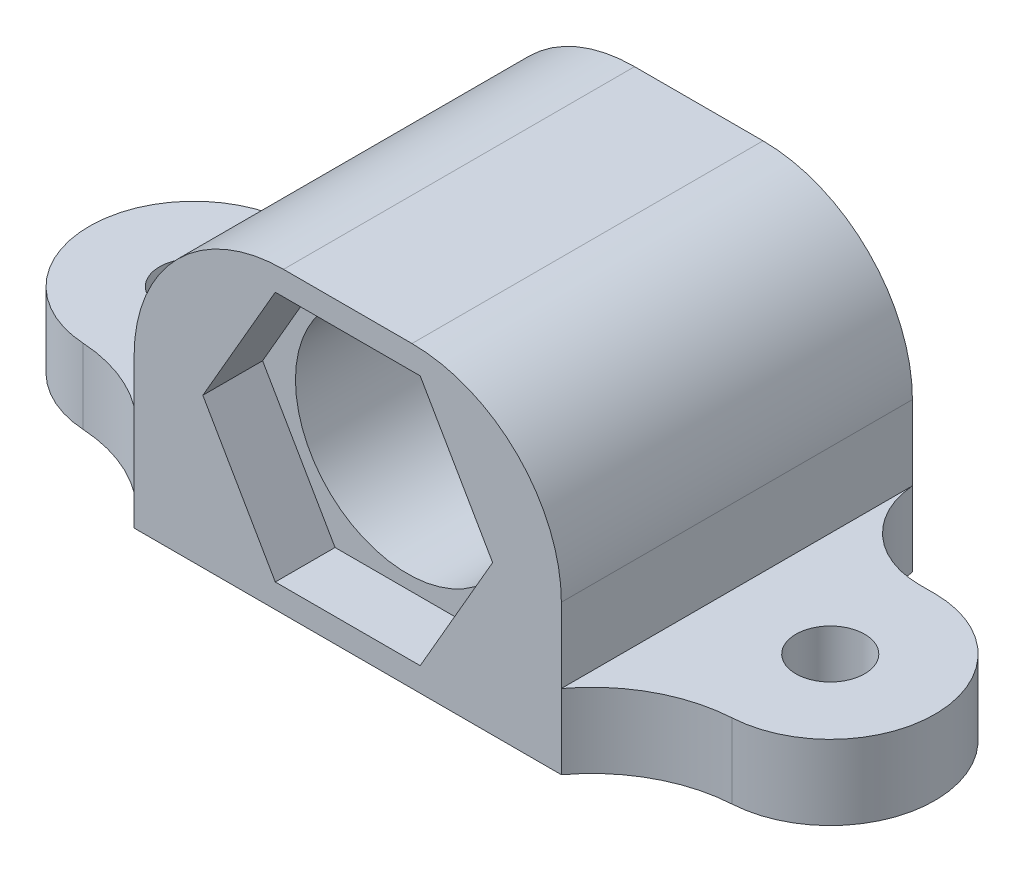
ISO-10303-21;
HEADER;
FILE_DESCRIPTION(('STEP AP214'),'2;1');
FILE_NAME('part.step','',(''),(''),'','','');
FILE_SCHEMA(('AUTOMOTIVE_DESIGN { 1 0 10303 214 1 1 1 1 }'));
ENDSEC;
DATA;
#1=APPLICATION_CONTEXT('core data for automotive mechanical design processes');
#2=APPLICATION_PROTOCOL_DEFINITION('international standard','automotive_design',2000,#1);
#3=PRODUCT_CONTEXT('',#1,'mechanical');
#4=PRODUCT('Part','Part','',(#3));
#5=PRODUCT_RELATED_PRODUCT_CATEGORY('part','',(#4));
#6=PRODUCT_DEFINITION_FORMATION('','',#4);
#7=PRODUCT_DEFINITION_CONTEXT('part definition',#1,'design');
#8=PRODUCT_DEFINITION('design','',#6,#7);
#9=PRODUCT_DEFINITION_SHAPE('','',#8);
#10=(LENGTH_UNIT() NAMED_UNIT(*) SI_UNIT(.MILLI.,.METRE.));
#11=(NAMED_UNIT(*) PLANE_ANGLE_UNIT() SI_UNIT($,.RADIAN.));
#12=(NAMED_UNIT(*) SI_UNIT($,.STERADIAN.) SOLID_ANGLE_UNIT());
#13=UNCERTAINTY_MEASURE_WITH_UNIT(LENGTH_MEASURE(1.E-05),#10,'distance_accuracy_value','');
#14=(GEOMETRIC_REPRESENTATION_CONTEXT(3) GLOBAL_UNCERTAINTY_ASSIGNED_CONTEXT((#13)) GLOBAL_UNIT_ASSIGNED_CONTEXT((#10,
#11,#12)) REPRESENTATION_CONTEXT('',''));
#15=CARTESIAN_POINT('',(0.,0.,0.));
#16=DIRECTION('',(0.,0.,1.));
#17=DIRECTION('',(1.,0.,0.));
#18=AXIS2_PLACEMENT_3D('',#15,#16,#17);
#19=CARTESIAN_POINT('',(0.,9.5,7.));
#20=DIRECTION('',(0.,0.,-1.));
#21=DIRECTION('',(-1.,0.,0.));
#22=AXIS2_PLACEMENT_3D('',#19,#20,#21);
#23=PLANE('',#22);
#24=CARTESIAN_POINT('',(21.3,14.5,7.));
#25=DIRECTION('',(0.,0.,-1.));
#26=DIRECTION('',(-1.,0.,0.));
#27=AXIS2_PLACEMENT_3D('',#24,#25,#26);
#28=CIRCLE('',#27,7.5);
#29=CARTESIAN_POINT('',(13.8,14.5,7.));
#30=VERTEX_POINT('',#29);
#31=EDGE_CURVE('E320',#30,#30,#28,.T.);
#32=ORIENTED_EDGE('',*,*,#31,.T.);
#33=EDGE_LOOP('',(#32));
#34=FACE_BOUND('',#33,.T.);
#35=DIRECTION('',(0.5,0.866025403784439,0.));
#36=VECTOR('',#35,1.);
#37=CARTESIAN_POINT('',(11.6005154776143,14.5,7.));
#38=LINE('',#37,#36);
#39=CARTESIAN_POINT('',(11.6005154776143,14.5,7.));
#40=VERTEX_POINT('',#39);
#41=CARTESIAN_POINT('',(16.4502577388071,22.9,7.));
#42=VERTEX_POINT('',#41);
#43=EDGE_CURVE('E191',#40,#42,#38,.T.);
#44=ORIENTED_EDGE('',*,*,#43,.F.);
#45=DIRECTION('',(-0.5,0.866025403784439,0.));
#46=VECTOR('',#45,1.);
#47=CARTESIAN_POINT('',(16.4502577388071,6.1,7.));
#48=LINE('',#47,#46);
#49=CARTESIAN_POINT('',(16.4502577388071,6.1,7.));
#50=VERTEX_POINT('',#49);
#51=EDGE_CURVE('E213',#50,#40,#48,.T.);
#52=ORIENTED_EDGE('',*,*,#51,.F.);
#53=DIRECTION('',(-1.,0.,0.));
#54=VECTOR('',#53,1.);
#55=CARTESIAN_POINT('',(26.1497422611928,6.09999999999999,7.));
#56=LINE('',#55,#54);
#57=CARTESIAN_POINT('',(26.1497422611928,6.09999999999999,7.));
#58=VERTEX_POINT('',#57);
#59=EDGE_CURVE('E217',#58,#50,#56,.T.);
#60=ORIENTED_EDGE('',*,*,#59,.F.);
#61=DIRECTION('',(-0.5,-0.866025403784439,0.));
#62=VECTOR('',#61,1.);
#63=CARTESIAN_POINT('',(30.9994845223857,14.5,7.));
#64=LINE('',#63,#62);
#65=CARTESIAN_POINT('',(30.9994845223857,14.5,7.));
#66=VERTEX_POINT('',#65);
#67=EDGE_CURVE('E240',#66,#58,#64,.T.);
#68=ORIENTED_EDGE('',*,*,#67,.F.);
#69=DIRECTION('',(0.5,-0.866025403784439,0.));
#70=VECTOR('',#69,1.);
#71=CARTESIAN_POINT('',(26.1497422611928,22.9,7.));
#72=LINE('',#71,#70);
#73=CARTESIAN_POINT('',(26.1497422611928,22.9,7.));
#74=VERTEX_POINT('',#73);
#75=EDGE_CURVE('E236',#74,#66,#72,.T.);
#76=ORIENTED_EDGE('',*,*,#75,.F.);
#77=DIRECTION('',(1.,0.,0.));
#78=VECTOR('',#77,1.);
#79=CARTESIAN_POINT('',(16.4502577388071,22.9,7.));
#80=LINE('',#79,#78);
#81=EDGE_CURVE('E233',#42,#74,#80,.T.);
#82=ORIENTED_EDGE('',*,*,#81,.F.);
#83=EDGE_LOOP('',(#44,#52,#60,#68,#76,#82));
#84=FACE_BOUND('',#83,.T.);
#85=ADVANCED_FACE('F45',(#34,#84),#23,.F.);
#86=CARTESIAN_POINT('',(0.,9.5,0.));
#87=DIRECTION('',(0.,1.,0.));
#88=DIRECTION('',(0.,0.,1.));
#89=AXIS2_PLACEMENT_3D('',#86,#87,#88);
#90=PLANE('',#89);
#91=DIRECTION('',(0.,0.,1.));
#92=VECTOR('',#91,1.);
#93=CARTESIAN_POINT('',(7.,9.5,0.));
#94=LINE('',#93,#92);
#95=CARTESIAN_POINT('',(7.,9.5,-12.5));
#96=VERTEX_POINT('',#95);
#97=CARTESIAN_POINT('',(7.,9.5,11.));
#98=VERTEX_POINT('',#97);
#99=EDGE_CURVE('E61',#96,#98,#94,.T.);
#100=ORIENTED_EDGE('',*,*,#99,.F.);
#101=CARTESIAN_POINT('',(1.0208696284493,9.5,-13.));
#102=DIRECTION('',(0.,1.,0.));
#103=DIRECTION('',(0.,0.,1.));
#104=AXIS2_PLACEMENT_3D('',#101,#102,#103);
#105=CIRCLE('',#104,6.);
#106=CARTESIAN_POINT('',(1.0208696284493,9.5,-7.));
#107=VERTEX_POINT('',#106);
#108=EDGE_CURVE('E401',#96,#107,#105,.F.);
#109=ORIENTED_EDGE('',*,*,#108,.T.);
#110=DIRECTION('',(-1.,0.,0.));
#111=VECTOR('',#110,1.);
#112=CARTESIAN_POINT('',(0.,9.5,-7.));
#113=LINE('',#112,#111);
#114=CARTESIAN_POINT('',(0.,9.5,-7.));
#115=VERTEX_POINT('',#114);
#116=EDGE_CURVE('E360',#107,#115,#113,.T.);
#117=ORIENTED_EDGE('',*,*,#116,.T.);
#118=CARTESIAN_POINT('',(0.,9.5,0.));
#119=DIRECTION('',(0.,1.,0.));
#120=DIRECTION('',(0.,0.,1.));
#121=AXIS2_PLACEMENT_3D('',#118,#119,#120);
#122=CIRCLE('',#121,7.);
#123=CARTESIAN_POINT('',(-0.421241205416516,9.5,6.98731392216345));
#124=VERTEX_POINT('',#123);
#125=EDGE_CURVE('E353',#115,#124,#122,.T.);
#126=ORIENTED_EDGE('',*,*,#125,.T.);
#127=CARTESIAN_POINT('',(-1.02301435601155,9.5,16.9691909538255));
#128=DIRECTION('',(0.,1.,0.));
#129=DIRECTION('',(0.,0.,1.));
#130=AXIS2_PLACEMENT_3D('',#127,#128,#129);
#131=CIRCLE('',#130,10.);
#132=EDGE_CURVE('E54',#124,#98,#131,.F.);
#133=ORIENTED_EDGE('',*,*,#132,.T.);
#134=EDGE_LOOP('',(#100,#109,#117,#126,#133));
#135=FACE_BOUND('',#134,.T.);
#136=CARTESIAN_POINT('',(0.,9.5,0.));
#137=DIRECTION('',(0.,1.,0.));
#138=DIRECTION('',(0.,0.,1.));
#139=AXIS2_PLACEMENT_3D('',#136,#137,#138);
#140=CIRCLE('',#139,2.3);
#141=CARTESIAN_POINT('',(0.,9.5,2.3));
#142=VERTEX_POINT('',#141);
#143=EDGE_CURVE('E349',#142,#142,#140,.T.);
#144=ORIENTED_EDGE('',*,*,#143,.F.);
#145=EDGE_LOOP('',(#144));
#146=FACE_BOUND('',#145,.T.);
#147=ADVANCED_FACE('F423',(#135,#146),#90,.T.);
#148=CARTESIAN_POINT('',(0.,9.5,-7.));
#149=DIRECTION('',(0.,0.,1.));
#150=DIRECTION('',(1.,0.,0.));
#151=AXIS2_PLACEMENT_3D('',#148,#149,#150);
#152=PLANE('',#151);
#153=DIRECTION('',(0.,-1.,0.));
#154=VECTOR('',#153,1.);
#155=CARTESIAN_POINT('',(1.0208696284493,9.5,-7.));
#156=LINE('',#155,#154);
#157=CARTESIAN_POINT('',(1.0208696284493,4.5,-7.));
#158=VERTEX_POINT('',#157);
#159=EDGE_CURVE('E394',#107,#158,#156,.T.);
#160=ORIENTED_EDGE('',*,*,#159,.T.);
#161=DIRECTION('',(1.,0.,0.));
#162=VECTOR('',#161,1.);
#163=CARTESIAN_POINT('',(49.6,4.5,-7.));
#164=LINE('',#163,#162);
#165=CARTESIAN_POINT('',(0.,4.5,-7.));
#166=VERTEX_POINT('',#165);
#167=EDGE_CURVE('E313',#166,#158,#164,.T.);
#168=ORIENTED_EDGE('',*,*,#167,.F.);
#169=DIRECTION('',(0.,-1.,0.));
#170=VECTOR('',#169,1.);
#171=CARTESIAN_POINT('',(0.,9.5,-7.));
#172=LINE('',#171,#170);
#173=EDGE_CURVE('E365',#115,#166,#172,.T.);
#174=ORIENTED_EDGE('',*,*,#173,.F.);
#175=ORIENTED_EDGE('',*,*,#116,.F.);
#176=EDGE_LOOP('',(#160,#168,#174,#175));
#177=FACE_BOUND('',#176,.T.);
#178=ADVANCED_FACE('F442',(#177),#152,.F.);
#179=DIRECTION('',(0.,0.,-1.));
#180=VECTOR('',#179,1.);
#181=CARTESIAN_POINT('',(35.6,9.5,0.));
#182=LINE('',#181,#180);
#183=CARTESIAN_POINT('',(35.6,9.5,11.));
#184=VERTEX_POINT('',#183);
#185=CARTESIAN_POINT('',(35.6,9.5,-12.5));
#186=VERTEX_POINT('',#185);
#187=EDGE_CURVE('E335',#184,#186,#182,.T.);
#188=ORIENTED_EDGE('',*,*,#187,.F.);
#189=CARTESIAN_POINT('',(43.6230143560115,9.5,16.9691909538255));
#190=DIRECTION('',(0.,1.,0.));
#191=DIRECTION('',(0.,0.,1.));
#192=AXIS2_PLACEMENT_3D('',#189,#190,#191);
#193=CIRCLE('',#192,10.);
#194=CARTESIAN_POINT('',(43.0212412054165,9.5,6.98731392216345));
#195=VERTEX_POINT('',#194);
#196=EDGE_CURVE('E418',#184,#195,#193,.F.);
#197=ORIENTED_EDGE('',*,*,#196,.T.);
#198=CARTESIAN_POINT('',(42.6,9.5,0.));
#199=DIRECTION('',(0.,1.,0.));
#200=DIRECTION('',(0.,0.,1.));
#201=AXIS2_PLACEMENT_3D('',#198,#199,#200);
#202=CIRCLE('',#201,7.);
#203=CARTESIAN_POINT('',(42.6,9.5,-7.));
#204=VERTEX_POINT('',#203);
#205=EDGE_CURVE('E357',#195,#204,#202,.T.);
#206=ORIENTED_EDGE('',*,*,#205,.T.);
#207=CARTESIAN_POINT('',(41.5791303715507,9.5,-7.));
#208=VERTEX_POINT('',#207);
#209=EDGE_CURVE('E361',#204,#208,#113,.T.);
#210=ORIENTED_EDGE('',*,*,#209,.T.);
#211=CARTESIAN_POINT('',(41.5791303715507,9.5,-13.));
#212=DIRECTION('',(0.,1.,0.));
#213=DIRECTION('',(0.,0.,1.));
#214=AXIS2_PLACEMENT_3D('',#211,#212,#213);
#215=CIRCLE('',#214,6.);
#216=EDGE_CURVE('E404',#208,#186,#215,.F.);
#217=ORIENTED_EDGE('',*,*,#216,.T.);
#218=EDGE_LOOP('',(#188,#197,#206,#210,#217));
#219=FACE_BOUND('',#218,.T.);
#220=CARTESIAN_POINT('',(42.6,9.5,0.));
#221=DIRECTION('',(0.,1.,0.));
#222=DIRECTION('',(0.,0.,1.));
#223=AXIS2_PLACEMENT_3D('',#220,#221,#222);
#224=CIRCLE('',#223,2.3);
#225=CARTESIAN_POINT('',(42.6,9.5,2.3));
#226=VERTEX_POINT('',#225);
#227=EDGE_CURVE('E345',#226,#226,#224,.T.);
#228=ORIENTED_EDGE('',*,*,#227,.F.);
#229=EDGE_LOOP('',(#228));
#230=FACE_BOUND('',#229,.T.);
#231=ADVANCED_FACE('F517',(#219,#230),#90,.T.);
#232=CARTESIAN_POINT('',(0.,9.5,0.));
#233=DIRECTION('',(0.,-1.,0.));
#234=DIRECTION('',(0.,0.,-1.));
#235=AXIS2_PLACEMENT_3D('',#232,#233,#234);
#236=CYLINDRICAL_SURFACE('',#235,7.);
#237=CARTESIAN_POINT('',(0.,4.5,0.));
#238=DIRECTION('',(0.,1.,0.));
#239=DIRECTION('',(0.,0.,1.));
#240=AXIS2_PLACEMENT_3D('',#237,#238,#239);
#241=CIRCLE('',#240,7.);
#242=CARTESIAN_POINT('',(-0.421241205416516,4.5,6.98731392216345));
#243=VERTEX_POINT('',#242);
#244=EDGE_CURVE('E310',#243,#166,#241,.F.);
#245=ORIENTED_EDGE('',*,*,#244,.F.);
#246=DIRECTION('',(0.,-1.,0.));
#247=VECTOR('',#246,1.);
#248=CARTESIAN_POINT('',(-0.421241205416516,9.5,6.98731392216345));
#249=LINE('',#248,#247);
#250=EDGE_CURVE('E412',#243,#124,#249,.F.);
#251=ORIENTED_EDGE('',*,*,#250,.T.);
#252=ORIENTED_EDGE('',*,*,#125,.F.);
#253=ORIENTED_EDGE('',*,*,#173,.T.);
#254=EDGE_LOOP('',(#245,#251,#252,#253));
#255=FACE_BOUND('',#254,.T.);
#256=ADVANCED_FACE('F438',(#255),#236,.T.);
#257=CARTESIAN_POINT('',(42.6,9.5,0.));
#258=DIRECTION('',(0.,-1.,0.));
#259=DIRECTION('',(0.,0.,-1.));
#260=AXIS2_PLACEMENT_3D('',#257,#258,#259);
#261=CYLINDRICAL_SURFACE('',#260,7.);
#262=ORIENTED_EDGE('',*,*,#205,.F.);
#263=DIRECTION('',(0.,-1.,0.));
#264=VECTOR('',#263,1.);
#265=CARTESIAN_POINT('',(43.0212412054165,9.5,6.98731392216345));
#266=LINE('',#265,#264);
#267=CARTESIAN_POINT('',(43.0212412054165,4.5,6.98731392216345));
#268=VERTEX_POINT('',#267);
#269=EDGE_CURVE('E408',#195,#268,#266,.T.);
#270=ORIENTED_EDGE('',*,*,#269,.T.);
#271=CARTESIAN_POINT('',(42.6,4.5,0.));
#272=DIRECTION('',(0.,1.,0.));
#273=DIRECTION('',(0.,0.,1.));
#274=AXIS2_PLACEMENT_3D('',#271,#272,#273);
#275=CIRCLE('',#274,7.);
#276=CARTESIAN_POINT('',(42.6,4.5,-7.));
#277=VERTEX_POINT('',#276);
#278=EDGE_CURVE('E306',#277,#268,#275,.F.);
#279=ORIENTED_EDGE('',*,*,#278,.F.);
#280=DIRECTION('',(0.,-1.,0.));
#281=VECTOR('',#280,1.);
#282=CARTESIAN_POINT('',(42.6,9.5,-7.));
#283=LINE('',#282,#281);
#284=EDGE_CURVE('E369',#204,#277,#283,.T.);
#285=ORIENTED_EDGE('',*,*,#284,.F.);
#286=EDGE_LOOP('',(#262,#270,#279,#285));
#287=FACE_BOUND('',#286,.T.);
#288=ADVANCED_FACE('F468',(#287),#261,.T.);
#289=ORIENTED_EDGE('',*,*,#284,.T.);
#290=DIRECTION('',(1.,0.,0.));
#291=VECTOR('',#290,1.);
#292=CARTESIAN_POINT('',(49.6,4.5,-7.));
#293=LINE('',#292,#291);
#294=CARTESIAN_POINT('',(41.5791303715507,4.5,-7.));
#295=VERTEX_POINT('',#294);
#296=EDGE_CURVE('E303',#295,#277,#293,.T.);
#297=ORIENTED_EDGE('',*,*,#296,.F.);
#298=DIRECTION('',(0.,1.,0.));
#299=VECTOR('',#298,1.);
#300=CARTESIAN_POINT('',(41.5791303715507,9.5,-7.));
#301=LINE('',#300,#299);
#302=EDGE_CURVE('E398',#295,#208,#301,.T.);
#303=ORIENTED_EDGE('',*,*,#302,.T.);
#304=ORIENTED_EDGE('',*,*,#209,.F.);
#305=EDGE_LOOP('',(#289,#297,#303,#304));
#306=FACE_BOUND('',#305,.T.);
#307=ADVANCED_FACE('F463',(#306),#152,.F.);
#308=CARTESIAN_POINT('',(0.,9.5,0.));
#309=DIRECTION('',(0.,-1.,0.));
#310=DIRECTION('',(0.,0.,-1.));
#311=AXIS2_PLACEMENT_3D('',#308,#309,#310);
#312=CYLINDRICAL_SURFACE('',#311,2.3);
#313=CARTESIAN_POINT('',(0.,4.5,0.));
#314=DIRECTION('',(0.,1.,0.));
#315=DIRECTION('',(0.,0.,1.));
#316=AXIS2_PLACEMENT_3D('',#313,#314,#315);
#317=CIRCLE('',#316,2.3);
#318=CARTESIAN_POINT('',(0.,4.5,2.3));
#319=VERTEX_POINT('',#318);
#320=EDGE_CURVE('E299',#319,#319,#317,.F.);
#321=ORIENTED_EDGE('',*,*,#320,.T.);
#322=EDGE_LOOP('',(#321));
#323=FACE_BOUND('',#322,.T.);
#324=ORIENTED_EDGE('',*,*,#143,.T.);
#325=EDGE_LOOP('',(#324));
#326=FACE_BOUND('',#325,.T.);
#327=ADVANCED_FACE('F504',(#323,#326),#312,.F.);
#328=CARTESIAN_POINT('',(42.6,9.5,0.));
#329=DIRECTION('',(0.,-1.,0.));
#330=DIRECTION('',(0.,0.,-1.));
#331=AXIS2_PLACEMENT_3D('',#328,#329,#330);
#332=CYLINDRICAL_SURFACE('',#331,2.3);
#333=CARTESIAN_POINT('',(42.6,4.5,0.));
#334=DIRECTION('',(0.,1.,0.));
#335=DIRECTION('',(0.,0.,1.));
#336=AXIS2_PLACEMENT_3D('',#333,#334,#335);
#337=CIRCLE('',#336,2.3);
#338=CARTESIAN_POINT('',(42.6,4.5,2.3));
#339=VERTEX_POINT('',#338);
#340=EDGE_CURVE('E295',#339,#339,#337,.F.);
#341=ORIENTED_EDGE('',*,*,#340,.T.);
#342=EDGE_LOOP('',(#341));
#343=FACE_BOUND('',#342,.T.);
#344=ORIENTED_EDGE('',*,*,#227,.T.);
#345=EDGE_LOOP('',(#344));
#346=FACE_BOUND('',#345,.T.);
#347=ADVANCED_FACE('F495',(#343,#346),#332,.F.);
#348=CARTESIAN_POINT('',(7.,0.,7.));
#349=DIRECTION('',(-1.,0.,0.));
#350=DIRECTION('',(0.,0.,1.));
#351=AXIS2_PLACEMENT_3D('',#348,#349,#350);
#352=PLANE('',#351);
#353=ORIENTED_EDGE('',*,*,#99,.T.);
#354=DIRECTION('',(0.,1.,0.));
#355=VECTOR('',#354,1.);
#356=CARTESIAN_POINT('',(7.,4.5,11.));
#357=LINE('',#356,#355);
#358=CARTESIAN_POINT('',(7.,14.5,11.));
#359=VERTEX_POINT('',#358);
#360=EDGE_CURVE('E268',#98,#359,#357,.T.);
#361=ORIENTED_EDGE('',*,*,#360,.T.);
#362=DIRECTION('',(0.,0.,1.));
#363=VECTOR('',#362,1.);
#364=CARTESIAN_POINT('',(7.,14.5,-12.5));
#365=LINE('',#364,#363);
#366=CARTESIAN_POINT('',(7.,14.5,-12.5));
#367=VERTEX_POINT('',#366);
#368=EDGE_CURVE('E380',#359,#367,#365,.F.);
#369=ORIENTED_EDGE('',*,*,#368,.T.);
#370=DIRECTION('',(0.,1.,0.));
#371=VECTOR('',#370,1.);
#372=CARTESIAN_POINT('',(7.,0.,-12.5));
#373=LINE('',#372,#371);
#374=EDGE_CURVE('E336',#96,#367,#373,.T.);
#375=ORIENTED_EDGE('',*,*,#374,.F.);
#376=EDGE_LOOP('',(#353,#361,#369,#375));
#377=FACE_BOUND('',#376,.T.);
#378=ADVANCED_FACE('F490',(#377),#352,.T.);
#379=CARTESIAN_POINT('',(7.,0.,-12.5));
#380=DIRECTION('',(0.,0.,-1.));
#381=DIRECTION('',(-1.,0.,0.));
#382=AXIS2_PLACEMENT_3D('',#379,#380,#381);
#383=PLANE('',#382);
#384=DIRECTION('',(1.,0.,0.));
#385=VECTOR('',#384,1.);
#386=CARTESIAN_POINT('',(49.6,4.5,-12.5));
#387=LINE('',#386,#385);
#388=CARTESIAN_POINT('',(7.,4.5,-12.5));
#389=VERTEX_POINT('',#388);
#390=CARTESIAN_POINT('',(35.6,4.5,-12.5));
#391=VERTEX_POINT('',#390);
#392=EDGE_CURVE('E316',#389,#391,#387,.T.);
#393=ORIENTED_EDGE('',*,*,#392,.F.);
#394=EDGE_CURVE('E332',#389,#96,#373,.T.);
#395=ORIENTED_EDGE('',*,*,#394,.T.);
#396=ORIENTED_EDGE('',*,*,#374,.T.);
#397=CARTESIAN_POINT('',(17.,14.5,-12.5));
#398=DIRECTION('',(0.,0.,-1.));
#399=DIRECTION('',(-1.,0.,0.));
#400=AXIS2_PLACEMENT_3D('',#397,#398,#399);
#401=CIRCLE('',#400,10.);
#402=CARTESIAN_POINT('',(17.,24.5,-12.5));
#403=VERTEX_POINT('',#402);
#404=EDGE_CURVE('E388',#367,#403,#401,.T.);
#405=ORIENTED_EDGE('',*,*,#404,.T.);
#406=DIRECTION('',(-1.,0.,0.));
#407=VECTOR('',#406,1.);
#408=CARTESIAN_POINT('',(7.,24.5,-12.5));
#409=LINE('',#408,#407);
#410=CARTESIAN_POINT('',(25.6,24.5,-12.5));
#411=VERTEX_POINT('',#410);
#412=EDGE_CURVE('E324',#411,#403,#409,.T.);
#413=ORIENTED_EDGE('',*,*,#412,.F.);
#414=CARTESIAN_POINT('',(25.6,14.5,-12.5));
#415=DIRECTION('',(0.,0.,-1.));
#416=DIRECTION('',(-1.,0.,0.));
#417=AXIS2_PLACEMENT_3D('',#414,#415,#416);
#418=CIRCLE('',#417,10.);
#419=CARTESIAN_POINT('',(35.6,14.5,-12.5));
#420=VERTEX_POINT('',#419);
#421=EDGE_CURVE('E384',#411,#420,#418,.T.);
#422=ORIENTED_EDGE('',*,*,#421,.T.);
#423=DIRECTION('',(0.,1.,0.));
#424=VECTOR('',#423,1.);
#425=CARTESIAN_POINT('',(35.6,0.,-12.5));
#426=LINE('',#425,#424);
#427=EDGE_CURVE('E331',#186,#420,#426,.T.);
#428=ORIENTED_EDGE('',*,*,#427,.F.);
#429=EDGE_CURVE('E337',#391,#186,#426,.T.);
#430=ORIENTED_EDGE('',*,*,#429,.F.);
#431=EDGE_LOOP('',(#393,#395,#396,#405,#413,#422,#428,#430));
#432=FACE_BOUND('',#431,.T.);
#433=CARTESIAN_POINT('',(21.3,14.5,-12.5));
#434=DIRECTION('',(0.,0.,-1.));
#435=DIRECTION('',(-1.,0.,0.));
#436=AXIS2_PLACEMENT_3D('',#433,#434,#435);
#437=CIRCLE('',#436,7.5);
#438=CARTESIAN_POINT('',(13.8,14.5,-12.5));
#439=VERTEX_POINT('',#438);
#440=EDGE_CURVE('E319',#439,#439,#437,.T.);
#441=ORIENTED_EDGE('',*,*,#440,.F.);
#442=EDGE_LOOP('',(#441));
#443=FACE_BOUND('',#442,.T.);
#444=ADVANCED_FACE('F451',(#432,#443),#383,.T.);
#445=CARTESIAN_POINT('',(35.6,0.,-12.5));
#446=DIRECTION('',(1.,0.,0.));
#447=DIRECTION('',(0.,0.,-1.));
#448=AXIS2_PLACEMENT_3D('',#445,#446,#447);
#449=PLANE('',#448);
#450=DIRECTION('',(0.,-1.,0.));
#451=VECTOR('',#450,1.);
#452=CARTESIAN_POINT('',(35.6,4.5,11.));
#453=LINE('',#452,#451);
#454=CARTESIAN_POINT('',(35.6,14.4999999999999,11.));
#455=VERTEX_POINT('',#454);
#456=EDGE_CURVE('E285',#455,#184,#453,.T.);
#457=ORIENTED_EDGE('',*,*,#456,.T.);
#458=ORIENTED_EDGE('',*,*,#187,.T.);
#459=ORIENTED_EDGE('',*,*,#427,.T.);
#460=DIRECTION('',(0.,0.,-1.));
#461=VECTOR('',#460,1.);
#462=CARTESIAN_POINT('',(35.6,14.5,7.));
#463=LINE('',#462,#461);
#464=EDGE_CURVE('E391',#420,#455,#463,.F.);
#465=ORIENTED_EDGE('',*,*,#464,.T.);
#466=EDGE_LOOP('',(#457,#458,#459,#465));
#467=FACE_BOUND('',#466,.T.);
#468=ADVANCED_FACE('F479',(#467),#449,.T.);
#469=CARTESIAN_POINT('',(0.,24.5,0.));
#470=DIRECTION('',(0.,-1.,0.));
#471=DIRECTION('',(0.,0.,-1.));
#472=AXIS2_PLACEMENT_3D('',#469,#470,#471);
#473=PLANE('',#472);
#474=ORIENTED_EDGE('',*,*,#412,.T.);
#475=DIRECTION('',(0.,0.,1.));
#476=VECTOR('',#475,1.);
#477=CARTESIAN_POINT('',(17.,24.5,7.));
#478=LINE('',#477,#476);
#479=CARTESIAN_POINT('',(17.,24.5,11.));
#480=VERTEX_POINT('',#479);
#481=EDGE_CURVE('E377',#403,#480,#478,.T.);
#482=ORIENTED_EDGE('',*,*,#481,.T.);
#483=DIRECTION('',(1.,0.,0.));
#484=VECTOR('',#483,1.);
#485=CARTESIAN_POINT('',(25.6,24.5,11.));
#486=LINE('',#485,#484);
#487=CARTESIAN_POINT('',(25.6,24.5,11.));
#488=VERTEX_POINT('',#487);
#489=EDGE_CURVE('E276',#480,#488,#486,.T.);
#490=ORIENTED_EDGE('',*,*,#489,.T.);
#491=DIRECTION('',(0.,0.,-1.));
#492=VECTOR('',#491,1.);
#493=CARTESIAN_POINT('',(25.6,24.5,-12.5));
#494=LINE('',#493,#492);
#495=EDGE_CURVE('E373',#488,#411,#494,.T.);
#496=ORIENTED_EDGE('',*,*,#495,.T.);
#497=EDGE_LOOP('',(#474,#482,#490,#496));
#498=FACE_BOUND('',#497,.T.);
#499=ADVANCED_FACE('F484',(#498),#473,.F.);
#500=CARTESIAN_POINT('',(21.3,14.5,7.));
#501=DIRECTION('',(0.,0.,-1.));
#502=DIRECTION('',(-1.,0.,0.));
#503=AXIS2_PLACEMENT_3D('',#500,#501,#502);
#504=CYLINDRICAL_SURFACE('',#503,7.5);
#505=ORIENTED_EDGE('',*,*,#31,.F.);
#506=EDGE_LOOP('',(#505));
#507=FACE_BOUND('',#506,.T.);
#508=ORIENTED_EDGE('',*,*,#440,.T.);
#509=EDGE_LOOP('',(#508));
#510=FACE_BOUND('',#509,.T.);
#511=ADVANCED_FACE('F526',(#507,#510),#504,.F.);
#512=CARTESIAN_POINT('',(17.,14.5,0.));
#513=DIRECTION('',(0.,0.,-1.));
#514=DIRECTION('',(-1.,0.,0.));
#515=AXIS2_PLACEMENT_3D('',#512,#513,#514);
#516=CYLINDRICAL_SURFACE('',#515,10.);
#517=ORIENTED_EDGE('',*,*,#404,.F.);
#518=ORIENTED_EDGE('',*,*,#368,.F.);
#519=CARTESIAN_POINT('',(17.,14.5,11.));
#520=DIRECTION('',(0.,0.,-1.));
#521=DIRECTION('',(-1.,0.,0.));
#522=AXIS2_PLACEMENT_3D('',#519,#520,#521);
#523=CIRCLE('',#522,10.);
#524=EDGE_CURVE('E272',#359,#480,#523,.T.);
#525=ORIENTED_EDGE('',*,*,#524,.T.);
#526=ORIENTED_EDGE('',*,*,#481,.F.);
#527=EDGE_LOOP('',(#517,#518,#525,#526));
#528=FACE_BOUND('',#527,.T.);
#529=ADVANCED_FACE('F489',(#528),#516,.T.);
#530=CARTESIAN_POINT('',(25.6,14.5,0.));
#531=DIRECTION('',(0.,0.,1.));
#532=DIRECTION('',(1.,0.,0.));
#533=AXIS2_PLACEMENT_3D('',#530,#531,#532);
#534=CYLINDRICAL_SURFACE('',#533,10.);
#535=ORIENTED_EDGE('',*,*,#495,.F.);
#536=CARTESIAN_POINT('',(25.6,14.5,11.));
#537=DIRECTION('',(0.,0.,-1.));
#538=DIRECTION('',(1.,0.,0.));
#539=AXIS2_PLACEMENT_3D('',#536,#537,#538);
#540=CIRCLE('',#539,9.99999999999995);
#541=EDGE_CURVE('E280',#488,#455,#540,.T.);
#542=ORIENTED_EDGE('',*,*,#541,.T.);
#543=ORIENTED_EDGE('',*,*,#464,.F.);
#544=ORIENTED_EDGE('',*,*,#421,.F.);
#545=EDGE_LOOP('',(#535,#542,#543,#544));
#546=FACE_BOUND('',#545,.T.);
#547=ADVANCED_FACE('F482',(#546),#534,.T.);
#548=CARTESIAN_POINT('',(1.0208696284493,0.,-13.));
#549=DIRECTION('',(0.,-1.,0.));
#550=DIRECTION('',(0.,0.,-1.));
#551=AXIS2_PLACEMENT_3D('',#548,#549,#550);
#552=CYLINDRICAL_SURFACE('',#551,6.);
#553=ORIENTED_EDGE('',*,*,#394,.F.);
#554=CARTESIAN_POINT('',(1.0208696284493,4.5,-13.));
#555=DIRECTION('',(0.,1.,0.));
#556=DIRECTION('',(0.,0.,1.));
#557=AXIS2_PLACEMENT_3D('',#554,#555,#556);
#558=CIRCLE('',#557,6.);
#559=EDGE_CURVE('E292',#158,#389,#558,.T.);
#560=ORIENTED_EDGE('',*,*,#559,.F.);
#561=ORIENTED_EDGE('',*,*,#159,.F.);
#562=ORIENTED_EDGE('',*,*,#108,.F.);
#563=EDGE_LOOP('',(#553,#560,#561,#562));
#564=FACE_BOUND('',#563,.T.);
#565=ADVANCED_FACE('F448',(#564),#552,.F.);
#566=CARTESIAN_POINT('',(41.5791303715507,0.,-13.));
#567=DIRECTION('',(0.,1.,0.));
#568=DIRECTION('',(0.,0.,1.));
#569=AXIS2_PLACEMENT_3D('',#566,#567,#568);
#570=CYLINDRICAL_SURFACE('',#569,6.);
#571=ORIENTED_EDGE('',*,*,#302,.F.);
#572=CARTESIAN_POINT('',(41.5791303715507,4.5,-13.));
#573=DIRECTION('',(0.,1.,0.));
#574=DIRECTION('',(0.,0.,1.));
#575=AXIS2_PLACEMENT_3D('',#572,#573,#574);
#576=CIRCLE('',#575,6.);
#577=EDGE_CURVE('E289',#391,#295,#576,.T.);
#578=ORIENTED_EDGE('',*,*,#577,.F.);
#579=ORIENTED_EDGE('',*,*,#429,.T.);
#580=ORIENTED_EDGE('',*,*,#216,.F.);
#581=EDGE_LOOP('',(#571,#578,#579,#580));
#582=FACE_BOUND('',#581,.T.);
#583=ADVANCED_FACE('F459',(#582),#570,.F.);
#584=CARTESIAN_POINT('',(49.6,4.5,7.001));
#585=DIRECTION('',(0.,1.,0.));
#586=DIRECTION('',(0.,0.,1.));
#587=AXIS2_PLACEMENT_3D('',#584,#585,#586);
#588=PLANE('',#587);
#589=ORIENTED_EDGE('',*,*,#340,.F.);
#590=EDGE_LOOP('',(#589));
#591=FACE_BOUND('',#590,.T.);
#592=ORIENTED_EDGE('',*,*,#559,.T.);
#593=ORIENTED_EDGE('',*,*,#392,.T.);
#594=ORIENTED_EDGE('',*,*,#577,.T.);
#595=ORIENTED_EDGE('',*,*,#296,.T.);
#596=ORIENTED_EDGE('',*,*,#278,.T.);
#597=CARTESIAN_POINT('',(43.6230143560115,4.5,16.9691909538255));
#598=DIRECTION('',(0.,1.,0.));
#599=DIRECTION('',(0.,0.,1.));
#600=AXIS2_PLACEMENT_3D('',#597,#598,#599);
#601=CIRCLE('',#600,10.);
#602=CARTESIAN_POINT('',(35.6,4.5,11.));
#603=VERTEX_POINT('',#602);
#604=EDGE_CURVE('E415',#268,#603,#601,.T.);
#605=ORIENTED_EDGE('',*,*,#604,.T.);
#606=DIRECTION('',(-1.,0.,0.));
#607=VECTOR('',#606,1.);
#608=CARTESIAN_POINT('',(35.6,4.5,11.));
#609=LINE('',#608,#607);
#610=CARTESIAN_POINT('',(7.,4.5,11.));
#611=VERTEX_POINT('',#610);
#612=EDGE_CURVE('E250',#603,#611,#609,.T.);
#613=ORIENTED_EDGE('',*,*,#612,.T.);
#614=CARTESIAN_POINT('',(-1.02301435601155,4.5,16.9691909538255));
#615=DIRECTION('',(0.,1.,0.));
#616=DIRECTION('',(0.,0.,1.));
#617=AXIS2_PLACEMENT_3D('',#614,#615,#616);
#618=CIRCLE('',#617,10.);
#619=EDGE_CURVE('E11',#611,#243,#618,.T.);
#620=ORIENTED_EDGE('',*,*,#619,.T.);
#621=ORIENTED_EDGE('',*,*,#244,.T.);
#622=ORIENTED_EDGE('',*,*,#167,.T.);
#623=EDGE_LOOP('',(#592,#593,#594,#595,#596,#605,#613,#620,#621,#622));
#624=FACE_BOUND('',#623,.T.);
#625=ORIENTED_EDGE('',*,*,#320,.F.);
#626=EDGE_LOOP('',(#625));
#627=FACE_BOUND('',#626,.T.);
#628=ADVANCED_FACE('F434',(#591,#624,#627),#588,.F.);
#629=CARTESIAN_POINT('',(17.,14.5,11.));
#630=DIRECTION('',(0.,0.,-1.));
#631=DIRECTION('',(-1.,0.,0.));
#632=AXIS2_PLACEMENT_3D('',#629,#630,#631);
#633=PLANE('',#632);
#634=DIRECTION('',(-0.5,0.866025403784439,0.));
#635=VECTOR('',#634,1.);
#636=CARTESIAN_POINT('',(16.4502577388071,6.1,11.));
#637=LINE('',#636,#635);
#638=CARTESIAN_POINT('',(16.4502577388071,6.1,11.));
#639=VERTEX_POINT('',#638);
#640=CARTESIAN_POINT('',(11.6005154776143,14.5,11.));
#641=VERTEX_POINT('',#640);
#642=EDGE_CURVE('E196',#639,#641,#637,.T.);
#643=ORIENTED_EDGE('',*,*,#642,.T.);
#644=DIRECTION('',(0.5,0.866025403784439,0.));
#645=VECTOR('',#644,1.);
#646=CARTESIAN_POINT('',(11.6005154776143,14.5,11.));
#647=LINE('',#646,#645);
#648=CARTESIAN_POINT('',(16.4502577388071,22.9,11.));
#649=VERTEX_POINT('',#648);
#650=EDGE_CURVE('E189',#641,#649,#647,.T.);
#651=ORIENTED_EDGE('',*,*,#650,.T.);
#652=DIRECTION('',(1.,0.,0.));
#653=VECTOR('',#652,1.);
#654=CARTESIAN_POINT('',(16.4502577388071,22.9,11.));
#655=LINE('',#654,#653);
#656=CARTESIAN_POINT('',(26.1497422611928,22.9,11.));
#657=VERTEX_POINT('',#656);
#658=EDGE_CURVE('E200',#649,#657,#655,.T.);
#659=ORIENTED_EDGE('',*,*,#658,.T.);
#660=DIRECTION('',(0.5,-0.866025403784439,0.));
#661=VECTOR('',#660,1.);
#662=CARTESIAN_POINT('',(26.1497422611928,22.9,11.));
#663=LINE('',#662,#661);
#664=CARTESIAN_POINT('',(30.9994845223857,14.5,11.));
#665=VERTEX_POINT('',#664);
#666=EDGE_CURVE('E206',#657,#665,#663,.T.);
#667=ORIENTED_EDGE('',*,*,#666,.T.);
#668=DIRECTION('',(-0.5,-0.866025403784439,0.));
#669=VECTOR('',#668,1.);
#670=CARTESIAN_POINT('',(30.9994845223857,14.5,11.));
#671=LINE('',#670,#669);
#672=CARTESIAN_POINT('',(26.1497422611928,6.09999999999999,11.));
#673=VERTEX_POINT('',#672);
#674=EDGE_CURVE('E222',#665,#673,#671,.T.);
#675=ORIENTED_EDGE('',*,*,#674,.T.);
#676=DIRECTION('',(-1.,0.,0.));
#677=VECTOR('',#676,1.);
#678=CARTESIAN_POINT('',(26.1497422611928,6.09999999999999,11.));
#679=LINE('',#678,#677);
#680=EDGE_CURVE('E226',#673,#639,#679,.T.);
#681=ORIENTED_EDGE('',*,*,#680,.T.);
#682=EDGE_LOOP('',(#643,#651,#659,#667,#675,#681));
#683=FACE_BOUND('',#682,.T.);
#684=ORIENTED_EDGE('',*,*,#612,.F.);
#685=EDGE_CURVE('E284',#184,#603,#453,.T.);
#686=ORIENTED_EDGE('',*,*,#685,.F.);
#687=ORIENTED_EDGE('',*,*,#456,.F.);
#688=ORIENTED_EDGE('',*,*,#541,.F.);
#689=ORIENTED_EDGE('',*,*,#489,.F.);
#690=ORIENTED_EDGE('',*,*,#524,.F.);
#691=ORIENTED_EDGE('',*,*,#360,.F.);
#692=EDGE_CURVE('E269',#611,#98,#357,.T.);
#693=ORIENTED_EDGE('',*,*,#692,.F.);
#694=EDGE_LOOP('',(#684,#686,#687,#688,#689,#690,#691,#693));
#695=FACE_BOUND('',#694,.T.);
#696=ADVANCED_FACE('F208',(#683,#695),#633,.F.);
#697=CARTESIAN_POINT('',(11.6005154776143,14.5,11.));
#698=DIRECTION('',(-0.866025403784439,0.5,0.));
#699=DIRECTION('',(-0.5,-0.866025403784439,0.));
#700=AXIS2_PLACEMENT_3D('',#697,#698,#699);
#701=PLANE('',#700);
#702=ORIENTED_EDGE('',*,*,#43,.T.);
#703=DIRECTION('',(0.,0.,-1.));
#704=VECTOR('',#703,1.);
#705=CARTESIAN_POINT('',(16.4502577388071,22.9,11.));
#706=LINE('',#705,#704);
#707=EDGE_CURVE('E184',#649,#42,#706,.T.);
#708=ORIENTED_EDGE('',*,*,#707,.F.);
#709=ORIENTED_EDGE('',*,*,#650,.F.);
#710=DIRECTION('',(0.,0.,-1.));
#711=VECTOR('',#710,1.);
#712=CARTESIAN_POINT('',(11.6005154776143,14.5,11.));
#713=LINE('',#712,#711);
#714=EDGE_CURVE('E247',#641,#40,#713,.T.);
#715=ORIENTED_EDGE('',*,*,#714,.T.);
#716=EDGE_LOOP('',(#702,#708,#709,#715));
#717=FACE_BOUND('',#716,.T.);
#718=ADVANCED_FACE('F186',(#717),#701,.F.);
#719=CARTESIAN_POINT('',(16.4502577388071,6.1,11.));
#720=DIRECTION('',(-0.866025403784439,-0.5,0.));
#721=DIRECTION('',(0.5,-0.866025403784439,0.));
#722=AXIS2_PLACEMENT_3D('',#719,#720,#721);
#723=PLANE('',#722);
#724=ORIENTED_EDGE('',*,*,#51,.T.);
#725=ORIENTED_EDGE('',*,*,#714,.F.);
#726=ORIENTED_EDGE('',*,*,#642,.F.);
#727=DIRECTION('',(0.,0.,-1.));
#728=VECTOR('',#727,1.);
#729=CARTESIAN_POINT('',(16.4502577388071,6.1,11.));
#730=LINE('',#729,#728);
#731=EDGE_CURVE('E251',#639,#50,#730,.T.);
#732=ORIENTED_EDGE('',*,*,#731,.T.);
#733=EDGE_LOOP('',(#724,#725,#726,#732));
#734=FACE_BOUND('',#733,.T.);
#735=ADVANCED_FACE('F549',(#734),#723,.F.);
#736=CARTESIAN_POINT('',(26.1497422611928,6.09999999999999,11.));
#737=DIRECTION('',(0.,-1.,0.));
#738=DIRECTION('',(1.,0.,0.));
#739=AXIS2_PLACEMENT_3D('',#736,#737,#738);
#740=PLANE('',#739);
#741=ORIENTED_EDGE('',*,*,#59,.T.);
#742=ORIENTED_EDGE('',*,*,#731,.F.);
#743=ORIENTED_EDGE('',*,*,#680,.F.);
#744=DIRECTION('',(0.,0.,-1.));
#745=VECTOR('',#744,1.);
#746=CARTESIAN_POINT('',(26.1497422611928,6.09999999999999,11.));
#747=LINE('',#746,#745);
#748=EDGE_CURVE('E255',#673,#58,#747,.T.);
#749=ORIENTED_EDGE('',*,*,#748,.T.);
#750=EDGE_LOOP('',(#741,#742,#743,#749));
#751=FACE_BOUND('',#750,.T.);
#752=ADVANCED_FACE('F587',(#751),#740,.F.);
#753=CARTESIAN_POINT('',(30.9994845223857,14.5,11.));
#754=DIRECTION('',(0.866025403784439,-0.5,0.));
#755=DIRECTION('',(0.5,0.866025403784439,0.));
#756=AXIS2_PLACEMENT_3D('',#753,#754,#755);
#757=PLANE('',#756);
#758=ORIENTED_EDGE('',*,*,#67,.T.);
#759=ORIENTED_EDGE('',*,*,#748,.F.);
#760=ORIENTED_EDGE('',*,*,#674,.F.);
#761=DIRECTION('',(0.,0.,-1.));
#762=VECTOR('',#761,1.);
#763=CARTESIAN_POINT('',(30.9994845223857,14.5,11.));
#764=LINE('',#763,#762);
#765=EDGE_CURVE('E259',#665,#66,#764,.T.);
#766=ORIENTED_EDGE('',*,*,#765,.T.);
#767=EDGE_LOOP('',(#758,#759,#760,#766));
#768=FACE_BOUND('',#767,.T.);
#769=ADVANCED_FACE('F542',(#768),#757,.F.);
#770=CARTESIAN_POINT('',(26.1497422611928,22.9,11.));
#771=DIRECTION('',(0.866025403784439,0.5,0.));
#772=DIRECTION('',(-0.5,0.866025403784439,0.));
#773=AXIS2_PLACEMENT_3D('',#770,#771,#772);
#774=PLANE('',#773);
#775=ORIENTED_EDGE('',*,*,#75,.T.);
#776=ORIENTED_EDGE('',*,*,#765,.F.);
#777=ORIENTED_EDGE('',*,*,#666,.F.);
#778=DIRECTION('',(0.,0.,-1.));
#779=VECTOR('',#778,1.);
#780=CARTESIAN_POINT('',(26.1497422611928,22.9,11.));
#781=LINE('',#780,#779);
#782=EDGE_CURVE('E195',#657,#74,#781,.T.);
#783=ORIENTED_EDGE('',*,*,#782,.T.);
#784=EDGE_LOOP('',(#775,#776,#777,#783));
#785=FACE_BOUND('',#784,.T.);
#786=ADVANCED_FACE('F537',(#785),#774,.F.);
#787=CARTESIAN_POINT('',(16.4502577388071,22.9,11.));
#788=DIRECTION('',(0.,1.,0.));
#789=DIRECTION('',(0.,0.,1.));
#790=AXIS2_PLACEMENT_3D('',#787,#788,#789);
#791=PLANE('',#790);
#792=ORIENTED_EDGE('',*,*,#81,.T.);
#793=ORIENTED_EDGE('',*,*,#782,.F.);
#794=ORIENTED_EDGE('',*,*,#658,.F.);
#795=ORIENTED_EDGE('',*,*,#707,.T.);
#796=EDGE_LOOP('',(#792,#793,#794,#795));
#797=FACE_BOUND('',#796,.T.);
#798=ADVANCED_FACE('F201',(#797),#791,.F.);
#799=CARTESIAN_POINT('',(43.6230143560115,0.,16.9691909538255));
#800=DIRECTION('',(0.,1.,0.));
#801=DIRECTION('',(0.,0.,1.));
#802=AXIS2_PLACEMENT_3D('',#799,#800,#801);
#803=CYLINDRICAL_SURFACE('',#802,10.);
#804=ORIENTED_EDGE('',*,*,#196,.F.);
#805=ORIENTED_EDGE('',*,*,#685,.T.);
#806=ORIENTED_EDGE('',*,*,#604,.F.);
#807=ORIENTED_EDGE('',*,*,#269,.F.);
#808=EDGE_LOOP('',(#804,#805,#806,#807));
#809=FACE_BOUND('',#808,.T.);
#810=ADVANCED_FACE('F472',(#809),#803,.F.);
#811=CARTESIAN_POINT('',(-1.02301435601155,0.,16.9691909538255));
#812=DIRECTION('',(0.,-1.,0.));
#813=DIRECTION('',(0.,0.,-1.));
#814=AXIS2_PLACEMENT_3D('',#811,#812,#813);
#815=CYLINDRICAL_SURFACE('',#814,10.);
#816=ORIENTED_EDGE('',*,*,#619,.F.);
#817=ORIENTED_EDGE('',*,*,#692,.T.);
#818=ORIENTED_EDGE('',*,*,#132,.F.);
#819=ORIENTED_EDGE('',*,*,#250,.F.);
#820=EDGE_LOOP('',(#816,#817,#818,#819));
#821=FACE_BOUND('',#820,.T.);
#822=ADVANCED_FACE('F47',(#821),#815,.F.);
#823=CLOSED_SHELL('',(#85,#147,#178,#231,#256,#288,#307,#327,#347,#378,#444,#468,#499,#511,#529,
#547,#565,#583,#628,#696,#718,#735,#752,#769,#786,#798,#810,#822));
#824=MANIFOLD_SOLID_BREP('B2',#823);
#825=ADVANCED_BREP_SHAPE_REPRESENTATION('',(#18,#824),#14);
#826=SHAPE_DEFINITION_REPRESENTATION(#9,#825);
ENDSEC;
END-ISO-10303-21;
